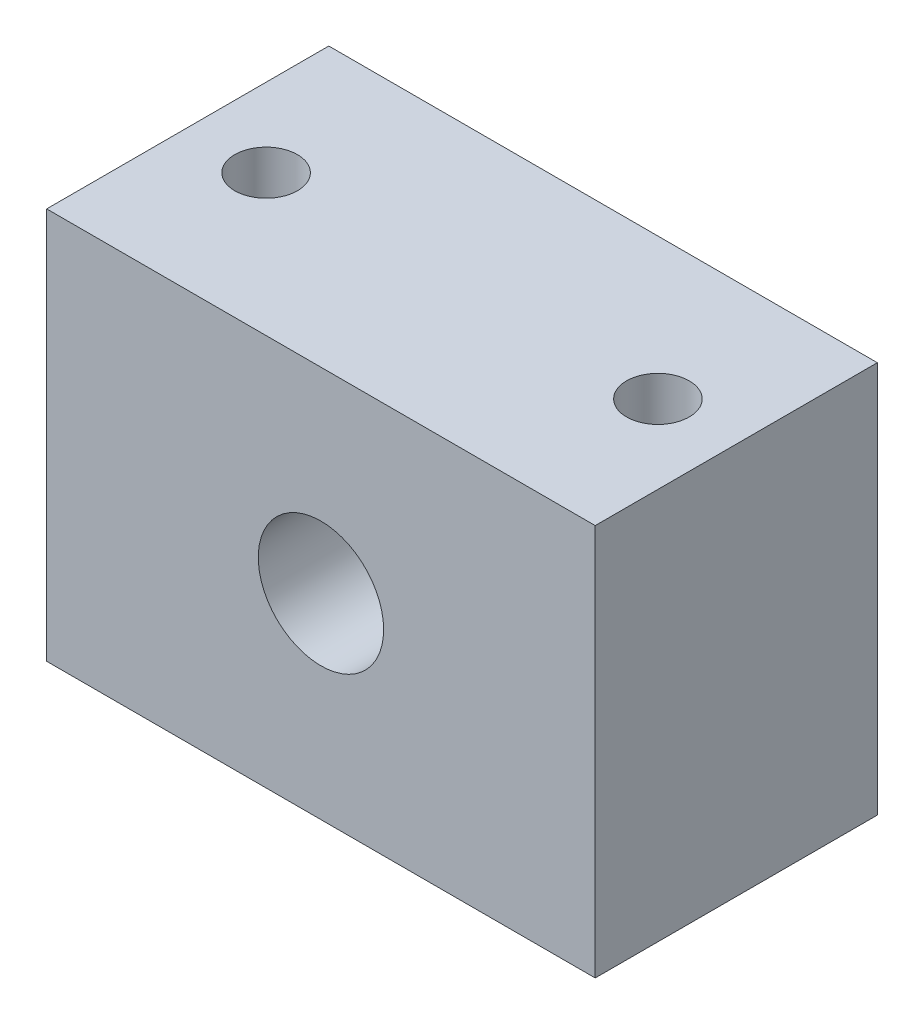
ISO-10303-21;
HEADER;
FILE_DESCRIPTION(('STEP AP214'),'2;1');
FILE_NAME('part.step','',(''),(''),'','','');
FILE_SCHEMA(('AUTOMOTIVE_DESIGN { 1 0 10303 214 1 1 1 1 }'));
ENDSEC;
DATA;
#1=APPLICATION_CONTEXT('core data for automotive mechanical design processes');
#2=APPLICATION_PROTOCOL_DEFINITION('international standard','automotive_design',2000,#1);
#3=PRODUCT_CONTEXT('',#1,'mechanical');
#4=PRODUCT('Part','Part','',(#3));
#5=PRODUCT_RELATED_PRODUCT_CATEGORY('part','',(#4));
#6=PRODUCT_DEFINITION_FORMATION('','',#4);
#7=PRODUCT_DEFINITION_CONTEXT('part definition',#1,'design');
#8=PRODUCT_DEFINITION('design','',#6,#7);
#9=PRODUCT_DEFINITION_SHAPE('','',#8);
#10=(LENGTH_UNIT() NAMED_UNIT(*) SI_UNIT(.MILLI.,.METRE.));
#11=(NAMED_UNIT(*) PLANE_ANGLE_UNIT() SI_UNIT($,.RADIAN.));
#12=(NAMED_UNIT(*) SI_UNIT($,.STERADIAN.) SOLID_ANGLE_UNIT());
#13=UNCERTAINTY_MEASURE_WITH_UNIT(LENGTH_MEASURE(1.E-05),#10,'distance_accuracy_value','');
#14=(GEOMETRIC_REPRESENTATION_CONTEXT(3) GLOBAL_UNCERTAINTY_ASSIGNED_CONTEXT((#13)) GLOBAL_UNIT_ASSIGNED_CONTEXT((#10,
#11,#12)) REPRESENTATION_CONTEXT('',''));
#15=CARTESIAN_POINT('',(0.,0.,0.));
#16=DIRECTION('',(0.,0.,1.));
#17=DIRECTION('',(1.,0.,0.));
#18=AXIS2_PLACEMENT_3D('',#15,#16,#17);
#19=CARTESIAN_POINT('',(0.,0.,18.));
#20=DIRECTION('',(0.,0.,1.));
#21=DIRECTION('',(1.,0.,0.));
#22=AXIS2_PLACEMENT_3D('',#19,#20,#21);
#23=PLANE('',#22);
#24=DIRECTION('',(0.,1.,0.));
#25=VECTOR('',#24,1.);
#26=CARTESIAN_POINT('',(17.5,12.5,18.));
#27=LINE('',#26,#25);
#28=CARTESIAN_POINT('',(17.5,-12.5,18.));
#29=VERTEX_POINT('',#28);
#30=CARTESIAN_POINT('',(17.5,12.5,18.));
#31=VERTEX_POINT('',#30);
#32=EDGE_CURVE('E85',#29,#31,#27,.T.);
#33=ORIENTED_EDGE('',*,*,#32,.T.);
#34=DIRECTION('',(-1.,0.,0.));
#35=VECTOR('',#34,1.);
#36=CARTESIAN_POINT('',(-17.5,12.5,18.));
#37=LINE('',#36,#35);
#38=CARTESIAN_POINT('',(-17.5,12.5,18.));
#39=VERTEX_POINT('',#38);
#40=EDGE_CURVE('E80',#31,#39,#37,.T.);
#41=ORIENTED_EDGE('',*,*,#40,.T.);
#42=DIRECTION('',(0.,-1.,0.));
#43=VECTOR('',#42,1.);
#44=CARTESIAN_POINT('',(-17.5,12.5,18.));
#45=LINE('',#44,#43);
#46=CARTESIAN_POINT('',(-17.5,-12.5,18.));
#47=VERTEX_POINT('',#46);
#48=EDGE_CURVE('E83',#39,#47,#45,.T.);
#49=ORIENTED_EDGE('',*,*,#48,.T.);
#50=DIRECTION('',(1.,0.,0.));
#51=VECTOR('',#50,1.);
#52=CARTESIAN_POINT('',(-17.5,-12.5,18.));
#53=LINE('',#52,#51);
#54=EDGE_CURVE('E50',#47,#29,#53,.T.);
#55=ORIENTED_EDGE('',*,*,#54,.T.);
#56=EDGE_LOOP('',(#33,#41,#49,#55));
#57=FACE_BOUND('',#56,.T.);
#58=CARTESIAN_POINT('',(0.,0.,18.));
#59=DIRECTION('',(0.,0.,1.));
#60=DIRECTION('',(1.,0.,0.));
#61=AXIS2_PLACEMENT_3D('',#58,#59,#60);
#62=CIRCLE('',#61,4.);
#63=CARTESIAN_POINT('',(4.,0.,18.));
#64=VERTEX_POINT('',#63);
#65=EDGE_CURVE('E100',#64,#64,#62,.T.);
#66=ORIENTED_EDGE('',*,*,#65,.F.);
#67=EDGE_LOOP('',(#66));
#68=FACE_BOUND('',#67,.T.);
#69=ADVANCED_FACE('F33',(#57,#68),#23,.T.);
#70=CARTESIAN_POINT('',(0.,0.,0.));
#71=DIRECTION('',(0.,0.,1.));
#72=DIRECTION('',(1.,0.,0.));
#73=AXIS2_PLACEMENT_3D('',#70,#71,#72);
#74=PLANE('',#73);
#75=DIRECTION('',(0.,1.,0.));
#76=VECTOR('',#75,1.);
#77=CARTESIAN_POINT('',(17.5,12.5,0.));
#78=LINE('',#77,#76);
#79=CARTESIAN_POINT('',(17.5,-12.5,0.));
#80=VERTEX_POINT('',#79);
#81=CARTESIAN_POINT('',(17.5,12.5,0.));
#82=VERTEX_POINT('',#81);
#83=EDGE_CURVE('E97',#80,#82,#78,.T.);
#84=ORIENTED_EDGE('',*,*,#83,.F.);
#85=DIRECTION('',(1.,0.,0.));
#86=VECTOR('',#85,1.);
#87=CARTESIAN_POINT('',(-17.5,-12.5,0.));
#88=LINE('',#87,#86);
#89=CARTESIAN_POINT('',(-17.5,-12.5,0.));
#90=VERTEX_POINT('',#89);
#91=EDGE_CURVE('E73',#90,#80,#88,.T.);
#92=ORIENTED_EDGE('',*,*,#91,.F.);
#93=DIRECTION('',(0.,-1.,0.));
#94=VECTOR('',#93,1.);
#95=CARTESIAN_POINT('',(-17.5,12.5,0.));
#96=LINE('',#95,#94);
#97=CARTESIAN_POINT('',(-17.5,12.5,0.));
#98=VERTEX_POINT('',#97);
#99=EDGE_CURVE('E67',#98,#90,#96,.T.);
#100=ORIENTED_EDGE('',*,*,#99,.F.);
#101=DIRECTION('',(-1.,0.,0.));
#102=VECTOR('',#101,1.);
#103=CARTESIAN_POINT('',(-17.5,12.5,0.));
#104=LINE('',#103,#102);
#105=EDGE_CURVE('E89',#82,#98,#104,.T.);
#106=ORIENTED_EDGE('',*,*,#105,.F.);
#107=EDGE_LOOP('',(#84,#92,#100,#106));
#108=FACE_BOUND('',#107,.T.);
#109=CARTESIAN_POINT('',(0.,0.,0.));
#110=DIRECTION('',(0.,0.,1.));
#111=DIRECTION('',(1.,0.,0.));
#112=AXIS2_PLACEMENT_3D('',#109,#110,#111);
#113=CIRCLE('',#112,4.);
#114=CARTESIAN_POINT('',(4.,0.,0.));
#115=VERTEX_POINT('',#114);
#116=EDGE_CURVE('E112',#115,#115,#113,.T.);
#117=ORIENTED_EDGE('',*,*,#116,.T.);
#118=EDGE_LOOP('',(#117));
#119=FACE_BOUND('',#118,.T.);
#120=ADVANCED_FACE('F108',(#108,#119),#74,.F.);
#121=CARTESIAN_POINT('',(17.5,12.5,18.));
#122=DIRECTION('',(-1.,0.,0.));
#123=DIRECTION('',(0.,-1.,0.));
#124=AXIS2_PLACEMENT_3D('',#121,#122,#123);
#125=PLANE('',#124);
#126=ORIENTED_EDGE('',*,*,#83,.T.);
#127=DIRECTION('',(0.,0.,-1.));
#128=VECTOR('',#127,1.);
#129=CARTESIAN_POINT('',(17.5,12.5,18.));
#130=LINE('',#129,#128);
#131=EDGE_CURVE('E11',#31,#82,#130,.T.);
#132=ORIENTED_EDGE('',*,*,#131,.F.);
#133=ORIENTED_EDGE('',*,*,#32,.F.);
#134=DIRECTION('',(0.,0.,-1.));
#135=VECTOR('',#134,1.);
#136=CARTESIAN_POINT('',(17.5,-12.5,18.));
#137=LINE('',#136,#135);
#138=EDGE_CURVE('E93',#29,#80,#137,.T.);
#139=ORIENTED_EDGE('',*,*,#138,.T.);
#140=EDGE_LOOP('',(#126,#132,#133,#139));
#141=FACE_BOUND('',#140,.T.);
#142=ADVANCED_FACE('F35',(#141),#125,.F.);
#143=CARTESIAN_POINT('',(-17.5,12.5,18.));
#144=DIRECTION('',(0.,-1.,0.));
#145=DIRECTION('',(0.,0.,-1.));
#146=AXIS2_PLACEMENT_3D('',#143,#144,#145);
#147=PLANE('',#146);
#148=CARTESIAN_POINT('',(-12.5,12.5,9.));
#149=DIRECTION('',(0.,1.,0.));
#150=DIRECTION('',(0.,0.,1.));
#151=AXIS2_PLACEMENT_3D('',#148,#149,#150);
#152=CIRCLE('',#151,2.);
#153=CARTESIAN_POINT('',(-12.5,12.5,11.));
#154=VERTEX_POINT('',#153);
#155=EDGE_CURVE('E124',#154,#154,#152,.T.);
#156=ORIENTED_EDGE('',*,*,#155,.F.);
#157=EDGE_LOOP('',(#156));
#158=FACE_BOUND('',#157,.T.);
#159=CARTESIAN_POINT('',(12.5,12.5,9.));
#160=DIRECTION('',(0.,1.,0.));
#161=DIRECTION('',(0.,0.,-1.));
#162=AXIS2_PLACEMENT_3D('',#159,#160,#161);
#163=CIRCLE('',#162,2.);
#164=CARTESIAN_POINT('',(12.5,12.5,7.));
#165=VERTEX_POINT('',#164);
#166=EDGE_CURVE('E118',#165,#165,#163,.T.);
#167=ORIENTED_EDGE('',*,*,#166,.F.);
#168=EDGE_LOOP('',(#167));
#169=FACE_BOUND('',#168,.T.);
#170=ORIENTED_EDGE('',*,*,#105,.T.);
#171=DIRECTION('',(0.,0.,-1.));
#172=VECTOR('',#171,1.);
#173=CARTESIAN_POINT('',(-17.5,12.5,18.));
#174=LINE('',#173,#172);
#175=EDGE_CURVE('E42',#39,#98,#174,.T.);
#176=ORIENTED_EDGE('',*,*,#175,.F.);
#177=ORIENTED_EDGE('',*,*,#40,.F.);
#178=ORIENTED_EDGE('',*,*,#131,.T.);
#179=EDGE_LOOP('',(#170,#176,#177,#178));
#180=FACE_BOUND('',#179,.T.);
#181=ADVANCED_FACE('F88',(#158,#169,#180),#147,.F.);
#182=CARTESIAN_POINT('',(-17.5,12.5,18.));
#183=DIRECTION('',(1.,0.,0.));
#184=DIRECTION('',(0.,1.,0.));
#185=AXIS2_PLACEMENT_3D('',#182,#183,#184);
#186=PLANE('',#185);
#187=ORIENTED_EDGE('',*,*,#99,.T.);
#188=DIRECTION('',(0.,0.,-1.));
#189=VECTOR('',#188,1.);
#190=CARTESIAN_POINT('',(-17.5,-12.5,18.));
#191=LINE('',#190,#189);
#192=EDGE_CURVE('E90',#47,#90,#191,.T.);
#193=ORIENTED_EDGE('',*,*,#192,.F.);
#194=ORIENTED_EDGE('',*,*,#48,.F.);
#195=ORIENTED_EDGE('',*,*,#175,.T.);
#196=EDGE_LOOP('',(#187,#193,#194,#195));
#197=FACE_BOUND('',#196,.T.);
#198=ADVANCED_FACE('F91',(#197),#186,.F.);
#199=CARTESIAN_POINT('',(-17.5,-12.5,18.));
#200=DIRECTION('',(0.,1.,0.));
#201=DIRECTION('',(0.,0.,1.));
#202=AXIS2_PLACEMENT_3D('',#199,#200,#201);
#203=PLANE('',#202);
#204=CARTESIAN_POINT('',(-12.5,-12.5,9.));
#205=DIRECTION('',(0.,1.,0.));
#206=DIRECTION('',(0.,0.,1.));
#207=AXIS2_PLACEMENT_3D('',#204,#205,#206);
#208=CIRCLE('',#207,2.);
#209=CARTESIAN_POINT('',(-12.5,-12.5,11.));
#210=VERTEX_POINT('',#209);
#211=EDGE_CURVE('E115',#210,#210,#208,.T.);
#212=ORIENTED_EDGE('',*,*,#211,.T.);
#213=EDGE_LOOP('',(#212));
#214=FACE_BOUND('',#213,.T.);
#215=CARTESIAN_POINT('',(12.5,-12.5,9.));
#216=DIRECTION('',(0.,1.,0.));
#217=DIRECTION('',(0.,0.,-1.));
#218=AXIS2_PLACEMENT_3D('',#215,#216,#217);
#219=CIRCLE('',#218,2.);
#220=CARTESIAN_POINT('',(12.5,-12.5,7.));
#221=VERTEX_POINT('',#220);
#222=EDGE_CURVE('E121',#221,#221,#219,.T.);
#223=ORIENTED_EDGE('',*,*,#222,.T.);
#224=EDGE_LOOP('',(#223));
#225=FACE_BOUND('',#224,.T.);
#226=ORIENTED_EDGE('',*,*,#91,.T.);
#227=ORIENTED_EDGE('',*,*,#138,.F.);
#228=ORIENTED_EDGE('',*,*,#54,.F.);
#229=ORIENTED_EDGE('',*,*,#192,.T.);
#230=EDGE_LOOP('',(#226,#227,#228,#229));
#231=FACE_BOUND('',#230,.T.);
#232=ADVANCED_FACE('F105',(#214,#225,#231),#203,.F.);
#233=CARTESIAN_POINT('',(0.,0.,18.));
#234=DIRECTION('',(0.,0.,-1.));
#235=DIRECTION('',(-1.,0.,0.));
#236=AXIS2_PLACEMENT_3D('',#233,#234,#235);
#237=CYLINDRICAL_SURFACE('',#236,4.);
#238=ORIENTED_EDGE('',*,*,#65,.T.);
#239=EDGE_LOOP('',(#238));
#240=FACE_BOUND('',#239,.T.);
#241=ORIENTED_EDGE('',*,*,#116,.F.);
#242=EDGE_LOOP('',(#241));
#243=FACE_BOUND('',#242,.T.);
#244=ADVANCED_FACE('F144',(#240,#243),#237,.F.);
#245=CARTESIAN_POINT('',(12.5,-12.5,9.));
#246=DIRECTION('',(0.,1.,0.));
#247=DIRECTION('',(0.,0.,1.));
#248=AXIS2_PLACEMENT_3D('',#245,#246,#247);
#249=CYLINDRICAL_SURFACE('',#248,2.);
#250=ORIENTED_EDGE('',*,*,#222,.F.);
#251=EDGE_LOOP('',(#250));
#252=FACE_BOUND('',#251,.T.);
#253=ORIENTED_EDGE('',*,*,#166,.T.);
#254=EDGE_LOOP('',(#253));
#255=FACE_BOUND('',#254,.T.);
#256=ADVANCED_FACE('F135',(#252,#255),#249,.F.);
#257=CARTESIAN_POINT('',(-12.5,-12.5,9.));
#258=DIRECTION('',(0.,1.,0.));
#259=DIRECTION('',(0.,0.,1.));
#260=AXIS2_PLACEMENT_3D('',#257,#258,#259);
#261=CYLINDRICAL_SURFACE('',#260,2.);
#262=ORIENTED_EDGE('',*,*,#211,.F.);
#263=EDGE_LOOP('',(#262));
#264=FACE_BOUND('',#263,.T.);
#265=ORIENTED_EDGE('',*,*,#155,.T.);
#266=EDGE_LOOP('',(#265));
#267=FACE_BOUND('',#266,.T.);
#268=ADVANCED_FACE('F132',(#264,#267),#261,.F.);
#269=CLOSED_SHELL('',(#69,#120,#142,#181,#198,#232,#244,#256,#268));
#270=MANIFOLD_SOLID_BREP('B2',#269);
#271=ADVANCED_BREP_SHAPE_REPRESENTATION('',(#18,#270),#14);
#272=SHAPE_DEFINITION_REPRESENTATION(#9,#271);
ENDSEC;
END-ISO-10303-21;
